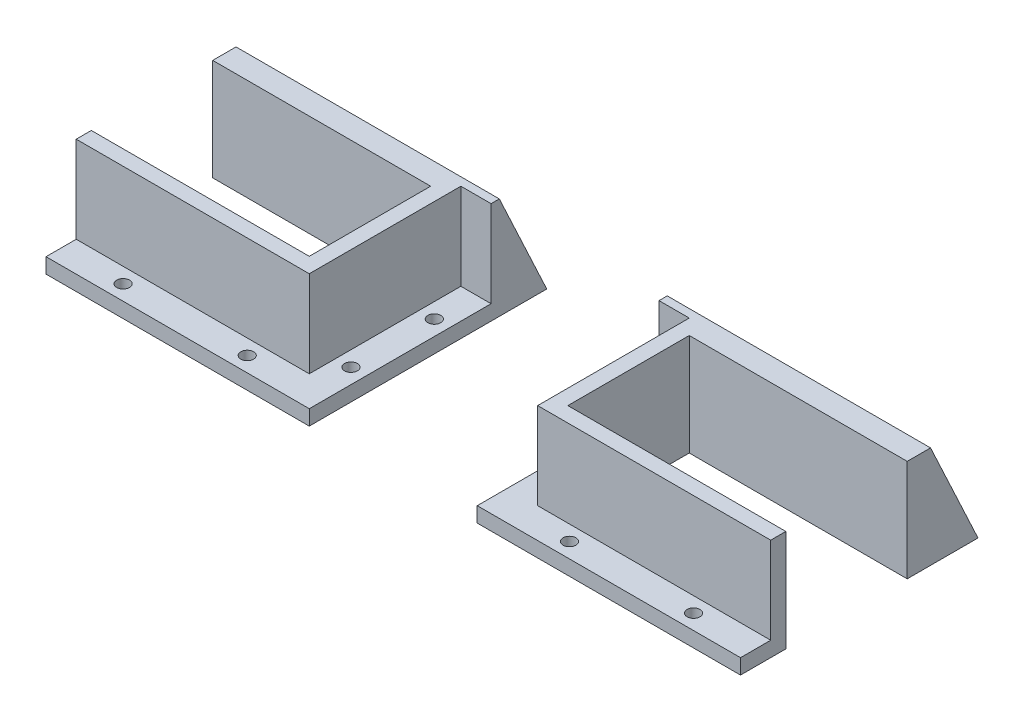
ISO-10303-21;
HEADER;
FILE_DESCRIPTION(('STEP AP214'),'2;1');
FILE_NAME('part.step','',(''),(''),'','','');
FILE_SCHEMA(('AUTOMOTIVE_DESIGN { 1 0 10303 214 1 1 1 1 }'));
ENDSEC;
DATA;
#1=APPLICATION_CONTEXT('core data for automotive mechanical design processes');
#2=APPLICATION_PROTOCOL_DEFINITION('international standard','automotive_design',2000,#1);
#3=PRODUCT_CONTEXT('',#1,'mechanical');
#4=PRODUCT('Part','Part','',(#3));
#5=PRODUCT_RELATED_PRODUCT_CATEGORY('part','',(#4));
#6=PRODUCT_DEFINITION_FORMATION('','',#4);
#7=PRODUCT_DEFINITION_CONTEXT('part definition',#1,'design');
#8=PRODUCT_DEFINITION('design','',#6,#7);
#9=PRODUCT_DEFINITION_SHAPE('','',#8);
#10=(LENGTH_UNIT() NAMED_UNIT(*) SI_UNIT(.MILLI.,.METRE.));
#11=(NAMED_UNIT(*) PLANE_ANGLE_UNIT() SI_UNIT($,.RADIAN.));
#12=(NAMED_UNIT(*) SI_UNIT($,.STERADIAN.) SOLID_ANGLE_UNIT());
#13=UNCERTAINTY_MEASURE_WITH_UNIT(LENGTH_MEASURE(1.E-05),#10,'distance_accuracy_value','');
#14=(GEOMETRIC_REPRESENTATION_CONTEXT(3) GLOBAL_UNCERTAINTY_ASSIGNED_CONTEXT((#13)) GLOBAL_UNIT_ASSIGNED_CONTEXT((#10,
#11,#12)) REPRESENTATION_CONTEXT('',''));
#15=CARTESIAN_POINT('',(0.,0.,0.));
#16=DIRECTION('',(0.,0.,1.));
#17=DIRECTION('',(1.,0.,0.));
#18=AXIS2_PLACEMENT_3D('',#15,#16,#17);
#19=CARTESIAN_POINT('',(24.005,21.395,15.935));
#20=DIRECTION('',(1.,0.,0.));
#21=DIRECTION('',(0.,0.,-1.));
#22=AXIS2_PLACEMENT_3D('',#19,#20,#21);
#23=PLANE('',#22);
#24=DIRECTION('',(0.,0.,-1.));
#25=VECTOR('',#24,1.);
#26=CARTESIAN_POINT('',(24.005,3.175,-15.935));
#27=LINE('',#26,#25);
#28=CARTESIAN_POINT('',(24.005,3.175,15.935));
#29=VERTEX_POINT('',#28);
#30=CARTESIAN_POINT('',(24.005,3.175,-15.935));
#31=VERTEX_POINT('',#30);
#32=EDGE_CURVE('E73',#29,#31,#27,.T.);
#33=ORIENTED_EDGE('',*,*,#32,.F.);
#34=DIRECTION('',(0.,-1.,0.));
#35=VECTOR('',#34,1.);
#36=CARTESIAN_POINT('',(24.005,21.395,15.935));
#37=LINE('',#36,#35);
#38=CARTESIAN_POINT('',(24.005,21.395,15.935));
#39=VERTEX_POINT('',#38);
#40=EDGE_CURVE('E195',#39,#29,#37,.T.);
#41=ORIENTED_EDGE('',*,*,#40,.F.);
#42=DIRECTION('',(0.,0.,1.));
#43=VECTOR('',#42,1.);
#44=CARTESIAN_POINT('',(24.005,21.395,15.935));
#45=LINE('',#44,#43);
#46=CARTESIAN_POINT('',(24.005,21.395,-15.935));
#47=VERTEX_POINT('',#46);
#48=EDGE_CURVE('E162',#47,#39,#45,.T.);
#49=ORIENTED_EDGE('',*,*,#48,.F.);
#50=DIRECTION('',(0.,-1.,0.));
#51=VECTOR('',#50,1.);
#52=CARTESIAN_POINT('',(24.005,21.395,-15.935));
#53=LINE('',#52,#51);
#54=EDGE_CURVE('E197',#47,#31,#53,.T.);
#55=ORIENTED_EDGE('',*,*,#54,.T.);
#56=EDGE_LOOP('',(#33,#41,#49,#55));
#57=FACE_BOUND('',#56,.T.);
#58=ADVANCED_FACE('F49',(#57),#23,.F.);
#59=CARTESIAN_POINT('',(73.,21.395,15.935));
#60=DIRECTION('',(0.,0.,-1.));
#61=DIRECTION('',(-1.,0.,0.));
#62=AXIS2_PLACEMENT_3D('',#59,#60,#61);
#63=PLANE('',#62);
#64=DIRECTION('',(-1.,0.,0.));
#65=VECTOR('',#64,1.);
#66=CARTESIAN_POINT('',(73.,3.175,15.935));
#67=LINE('',#66,#65);
#68=CARTESIAN_POINT('',(73.,3.175,15.935));
#69=VERTEX_POINT('',#68);
#70=EDGE_CURVE('E205',#69,#29,#67,.T.);
#71=ORIENTED_EDGE('',*,*,#70,.F.);
#72=DIRECTION('',(0.,-1.,0.));
#73=VECTOR('',#72,1.);
#74=CARTESIAN_POINT('',(73.,21.395,15.935));
#75=LINE('',#74,#73);
#76=CARTESIAN_POINT('',(73.,21.395,15.935));
#77=VERTEX_POINT('',#76);
#78=EDGE_CURVE('E192',#77,#69,#75,.T.);
#79=ORIENTED_EDGE('',*,*,#78,.F.);
#80=DIRECTION('',(1.,0.,0.));
#81=VECTOR('',#80,1.);
#82=CARTESIAN_POINT('',(73.,21.395,15.935));
#83=LINE('',#82,#81);
#84=EDGE_CURVE('E165',#39,#77,#83,.T.);
#85=ORIENTED_EDGE('',*,*,#84,.F.);
#86=ORIENTED_EDGE('',*,*,#40,.T.);
#87=EDGE_LOOP('',(#71,#79,#85,#86));
#88=FACE_BOUND('',#87,.T.);
#89=ADVANCED_FACE('F281',(#88),#63,.F.);
#90=CARTESIAN_POINT('',(73.,21.395,-15.935));
#91=DIRECTION('',(-1.,0.,0.));
#92=DIRECTION('',(0.,0.,1.));
#93=AXIS2_PLACEMENT_3D('',#90,#91,#92);
#94=PLANE('',#93);
#95=DIRECTION('',(0.,0.,-1.));
#96=VECTOR('',#95,1.);
#97=CARTESIAN_POINT('',(73.,0.,-15.935));
#98=LINE('',#97,#96);
#99=CARTESIAN_POINT('',(73.,0.,-12.76));
#100=VERTEX_POINT('',#99);
#101=CARTESIAN_POINT('',(73.,0.,-27.64));
#102=VERTEX_POINT('',#101);
#103=EDGE_CURVE('E12',#100,#102,#98,.T.);
#104=ORIENTED_EDGE('',*,*,#103,.T.);
#105=DIRECTION('',(0.,0.906307787036653,0.422618261740694));
#106=VECTOR('',#105,1.);
#107=CARTESIAN_POINT('',(73.,10.5867342039042,-22.7033247658681));
#108=LINE('',#107,#106);
#109=CARTESIAN_POINT('',(73.,21.395,-17.663347653774));
#110=VERTEX_POINT('',#109);
#111=EDGE_CURVE('E143',#102,#110,#108,.T.);
#112=ORIENTED_EDGE('',*,*,#111,.T.);
#113=DIRECTION('',(0.,0.,-1.));
#114=VECTOR('',#113,1.);
#115=CARTESIAN_POINT('',(73.,21.395,-15.935));
#116=LINE('',#115,#114);
#117=CARTESIAN_POINT('',(73.,21.395,-12.76));
#118=VERTEX_POINT('',#117);
#119=EDGE_CURVE('E53',#118,#110,#116,.T.);
#120=ORIENTED_EDGE('',*,*,#119,.F.);
#121=DIRECTION('',(0.,-1.,0.));
#122=VECTOR('',#121,1.);
#123=CARTESIAN_POINT('',(73.,21.395,-12.76));
#124=LINE('',#123,#122);
#125=EDGE_CURVE('E176',#118,#100,#124,.T.);
#126=ORIENTED_EDGE('',*,*,#125,.T.);
#127=EDGE_LOOP('',(#104,#112,#120,#126));
#128=FACE_BOUND('',#127,.T.);
#129=ADVANCED_FACE('F153',(#128),#94,.F.);
#130=CARTESIAN_POINT('',(73.,21.395,12.76));
#131=DIRECTION('',(-1.,0.,0.));
#132=DIRECTION('',(0.,0.,1.));
#133=AXIS2_PLACEMENT_3D('',#130,#131,#132);
#134=PLANE('',#133);
#135=DIRECTION('',(0.,0.,-1.));
#136=VECTOR('',#135,1.);
#137=CARTESIAN_POINT('',(73.,0.,12.76));
#138=LINE('',#137,#136);
#139=CARTESIAN_POINT('',(73.,0.,22.285));
#140=VERTEX_POINT('',#139);
#141=CARTESIAN_POINT('',(73.,0.,12.76));
#142=VERTEX_POINT('',#141);
#143=EDGE_CURVE('E58',#140,#142,#138,.T.);
#144=ORIENTED_EDGE('',*,*,#143,.T.);
#145=DIRECTION('',(0.,-1.,0.));
#146=VECTOR('',#145,1.);
#147=CARTESIAN_POINT('',(73.,21.395,12.76));
#148=LINE('',#147,#146);
#149=CARTESIAN_POINT('',(73.,21.395,12.76));
#150=VERTEX_POINT('',#149);
#151=EDGE_CURVE('E189',#150,#142,#148,.T.);
#152=ORIENTED_EDGE('',*,*,#151,.F.);
#153=DIRECTION('',(0.,0.,-1.));
#154=VECTOR('',#153,1.);
#155=CARTESIAN_POINT('',(73.,21.395,12.76));
#156=LINE('',#155,#154);
#157=EDGE_CURVE('E168',#77,#150,#156,.T.);
#158=ORIENTED_EDGE('',*,*,#157,.F.);
#159=ORIENTED_EDGE('',*,*,#78,.T.);
#160=DIRECTION('',(0.,0.,-1.));
#161=VECTOR('',#160,1.);
#162=CARTESIAN_POINT('',(73.,3.175,15.935));
#163=LINE('',#162,#161);
#164=CARTESIAN_POINT('',(73.,3.175,22.285));
#165=VERTEX_POINT('',#164);
#166=EDGE_CURVE('E215',#165,#69,#163,.T.);
#167=ORIENTED_EDGE('',*,*,#166,.F.);
#168=DIRECTION('',(0.,-1.,0.));
#169=VECTOR('',#168,1.);
#170=CARTESIAN_POINT('',(73.,3.175,22.285));
#171=LINE('',#170,#169);
#172=EDGE_CURVE('E202',#165,#140,#171,.T.);
#173=ORIENTED_EDGE('',*,*,#172,.T.);
#174=EDGE_LOOP('',(#144,#152,#158,#159,#167,#173));
#175=FACE_BOUND('',#174,.T.);
#176=ADVANCED_FACE('F270',(#175),#134,.F.);
#177=CARTESIAN_POINT('',(27.18,21.395,12.76));
#178=DIRECTION('',(0.,0.,1.));
#179=DIRECTION('',(1.,0.,0.));
#180=AXIS2_PLACEMENT_3D('',#177,#178,#179);
#181=PLANE('',#180);
#182=DIRECTION('',(-1.,0.,0.));
#183=VECTOR('',#182,1.);
#184=CARTESIAN_POINT('',(27.18,0.,12.76));
#185=LINE('',#184,#183);
#186=CARTESIAN_POINT('',(27.18,0.,12.76));
#187=VERTEX_POINT('',#186);
#188=EDGE_CURVE('E179',#142,#187,#185,.T.);
#189=ORIENTED_EDGE('',*,*,#188,.T.);
#190=DIRECTION('',(0.,-1.,0.));
#191=VECTOR('',#190,1.);
#192=CARTESIAN_POINT('',(27.18,21.395,12.76));
#193=LINE('',#192,#191);
#194=CARTESIAN_POINT('',(27.18,21.395,12.76));
#195=VERTEX_POINT('',#194);
#196=EDGE_CURVE('E186',#195,#187,#193,.T.);
#197=ORIENTED_EDGE('',*,*,#196,.F.);
#198=DIRECTION('',(-1.,0.,0.));
#199=VECTOR('',#198,1.);
#200=CARTESIAN_POINT('',(27.18,21.395,12.76));
#201=LINE('',#200,#199);
#202=EDGE_CURVE('E172',#150,#195,#201,.T.);
#203=ORIENTED_EDGE('',*,*,#202,.F.);
#204=ORIENTED_EDGE('',*,*,#151,.T.);
#205=EDGE_LOOP('',(#189,#197,#203,#204));
#206=FACE_BOUND('',#205,.T.);
#207=ADVANCED_FACE('F285',(#206),#181,.F.);
#208=CARTESIAN_POINT('',(27.18,21.395,-12.76));
#209=DIRECTION('',(-1.,0.,0.));
#210=DIRECTION('',(0.,0.,1.));
#211=AXIS2_PLACEMENT_3D('',#208,#209,#210);
#212=PLANE('',#211);
#213=DIRECTION('',(0.,0.,-1.));
#214=VECTOR('',#213,1.);
#215=CARTESIAN_POINT('',(27.18,0.,-12.76));
#216=LINE('',#215,#214);
#217=CARTESIAN_POINT('',(27.18,0.,-12.76));
#218=VERTEX_POINT('',#217);
#219=EDGE_CURVE('E163',#187,#218,#216,.T.);
#220=ORIENTED_EDGE('',*,*,#219,.T.);
#221=DIRECTION('',(0.,-1.,0.));
#222=VECTOR('',#221,1.);
#223=CARTESIAN_POINT('',(27.18,21.395,-12.76));
#224=LINE('',#223,#222);
#225=CARTESIAN_POINT('',(27.18,21.395,-12.76));
#226=VERTEX_POINT('',#225);
#227=EDGE_CURVE('E183',#226,#218,#224,.T.);
#228=ORIENTED_EDGE('',*,*,#227,.F.);
#229=DIRECTION('',(0.,0.,-1.));
#230=VECTOR('',#229,1.);
#231=CARTESIAN_POINT('',(27.18,21.395,-12.76));
#232=LINE('',#231,#230);
#233=EDGE_CURVE('E174',#195,#226,#232,.T.);
#234=ORIENTED_EDGE('',*,*,#233,.F.);
#235=ORIENTED_EDGE('',*,*,#196,.T.);
#236=EDGE_LOOP('',(#220,#228,#234,#235));
#237=FACE_BOUND('',#236,.T.);
#238=ADVANCED_FACE('F290',(#237),#212,.F.);
#239=CARTESIAN_POINT('',(73.,21.395,-12.76));
#240=DIRECTION('',(0.,0.,-1.));
#241=DIRECTION('',(-1.,0.,0.));
#242=AXIS2_PLACEMENT_3D('',#239,#240,#241);
#243=PLANE('',#242);
#244=DIRECTION('',(1.,0.,0.));
#245=VECTOR('',#244,1.);
#246=CARTESIAN_POINT('',(73.,0.,-12.76));
#247=LINE('',#246,#245);
#248=EDGE_CURVE('E161',#218,#100,#247,.T.);
#249=ORIENTED_EDGE('',*,*,#248,.T.);
#250=ORIENTED_EDGE('',*,*,#125,.F.);
#251=DIRECTION('',(1.,0.,0.));
#252=VECTOR('',#251,1.);
#253=CARTESIAN_POINT('',(73.,21.395,-12.76));
#254=LINE('',#253,#252);
#255=EDGE_CURVE('E159',#226,#118,#254,.T.);
#256=ORIENTED_EDGE('',*,*,#255,.F.);
#257=ORIENTED_EDGE('',*,*,#227,.T.);
#258=EDGE_LOOP('',(#249,#250,#256,#257));
#259=FACE_BOUND('',#258,.T.);
#260=ADVANCED_FACE('F293',(#259),#243,.F.);
#261=CARTESIAN_POINT('',(0.,21.395,0.));
#262=DIRECTION('',(0.,-1.,0.));
#263=DIRECTION('',(0.,0.,-1.));
#264=AXIS2_PLACEMENT_3D('',#261,#262,#263);
#265=PLANE('',#264);
#266=ORIENTED_EDGE('',*,*,#119,.T.);
#267=DIRECTION('',(-1.,0.,0.));
#268=VECTOR('',#267,1.);
#269=CARTESIAN_POINT('',(73.,21.395,-17.663347653774));
#270=LINE('',#269,#268);
#271=CARTESIAN_POINT('',(17.655,21.395,-17.663347653774));
#272=VERTEX_POINT('',#271);
#273=EDGE_CURVE('E140',#110,#272,#270,.T.);
#274=ORIENTED_EDGE('',*,*,#273,.T.);
#275=DIRECTION('',(0.,0.,-1.));
#276=VECTOR('',#275,1.);
#277=CARTESIAN_POINT('',(17.655,21.395,-27.64));
#278=LINE('',#277,#276);
#279=CARTESIAN_POINT('',(17.655,21.395,-15.935));
#280=VERTEX_POINT('',#279);
#281=EDGE_CURVE('E251',#280,#272,#278,.T.);
#282=ORIENTED_EDGE('',*,*,#281,.F.);
#283=DIRECTION('',(-1.,0.,0.));
#284=VECTOR('',#283,1.);
#285=CARTESIAN_POINT('',(17.655,21.395,-15.935));
#286=LINE('',#285,#284);
#287=EDGE_CURVE('E248',#47,#280,#286,.T.);
#288=ORIENTED_EDGE('',*,*,#287,.F.);
#289=ORIENTED_EDGE('',*,*,#48,.T.);
#290=ORIENTED_EDGE('',*,*,#84,.T.);
#291=ORIENTED_EDGE('',*,*,#157,.T.);
#292=ORIENTED_EDGE('',*,*,#202,.T.);
#293=ORIENTED_EDGE('',*,*,#233,.T.);
#294=ORIENTED_EDGE('',*,*,#255,.T.);
#295=EDGE_LOOP('',(#266,#274,#282,#288,#289,#290,#291,#292,#293,#294));
#296=FACE_BOUND('',#295,.T.);
#297=ADVANCED_FACE('F51',(#296),#265,.F.);
#298=CARTESIAN_POINT('',(0.,0.,0.));
#299=DIRECTION('',(0.,-1.,0.));
#300=DIRECTION('',(0.,0.,-1.));
#301=AXIS2_PLACEMENT_3D('',#298,#299,#300);
#302=PLANE('',#301);
#303=ORIENTED_EDGE('',*,*,#103,.F.);
#304=ORIENTED_EDGE('',*,*,#248,.F.);
#305=ORIENTED_EDGE('',*,*,#219,.F.);
#306=ORIENTED_EDGE('',*,*,#188,.F.);
#307=ORIENTED_EDGE('',*,*,#143,.F.);
#308=DIRECTION('',(1.,0.,0.));
#309=VECTOR('',#308,1.);
#310=CARTESIAN_POINT('',(73.,0.,22.285));
#311=LINE('',#310,#309);
#312=CARTESIAN_POINT('',(17.655,0.,22.285));
#313=VERTEX_POINT('',#312);
#314=EDGE_CURVE('E206',#313,#140,#311,.T.);
#315=ORIENTED_EDGE('',*,*,#314,.F.);
#316=DIRECTION('',(0.,0.,1.));
#317=VECTOR('',#316,1.);
#318=CARTESIAN_POINT('',(17.655,0.,-15.935));
#319=LINE('',#318,#317);
#320=CARTESIAN_POINT('',(17.655,0.,-27.64));
#321=VERTEX_POINT('',#320);
#322=EDGE_CURVE('E209',#321,#313,#319,.T.);
#323=ORIENTED_EDGE('',*,*,#322,.F.);
#324=DIRECTION('',(-1.,0.,0.));
#325=VECTOR('',#324,1.);
#326=CARTESIAN_POINT('',(73.,0.,-27.64));
#327=LINE('',#326,#325);
#328=EDGE_CURVE('E245',#102,#321,#327,.T.);
#329=ORIENTED_EDGE('',*,*,#328,.F.);
#330=EDGE_LOOP('',(#303,#304,#305,#306,#307,#315,#323,#329));
#331=FACE_BOUND('',#330,.T.);
#332=CARTESIAN_POINT('',(33.8725,0.,19.11));
#333=DIRECTION('',(0.,1.,0.));
#334=DIRECTION('',(0.,0.,1.));
#335=AXIS2_PLACEMENT_3D('',#332,#333,#334);
#336=CIRCLE('',#335,1.35);
#337=CARTESIAN_POINT('',(33.8725,0.,20.46));
#338=VERTEX_POINT('',#337);
#339=EDGE_CURVE('E236',#338,#338,#336,.T.);
#340=ORIENTED_EDGE('',*,*,#339,.T.);
#341=EDGE_LOOP('',(#340));
#342=FACE_BOUND('',#341,.T.);
#343=CARTESIAN_POINT('',(20.83,0.,-7.17374999999999));
#344=DIRECTION('',(0.,1.,0.));
#345=DIRECTION('',(0.,0.,1.));
#346=AXIS2_PLACEMENT_3D('',#343,#344,#345);
#347=CIRCLE('',#346,1.35);
#348=CARTESIAN_POINT('',(20.83,0.,-5.82374999999999));
#349=VERTEX_POINT('',#348);
#350=EDGE_CURVE('E224',#349,#349,#347,.T.);
#351=ORIENTED_EDGE('',*,*,#350,.T.);
#352=EDGE_LOOP('',(#351));
#353=FACE_BOUND('',#352,.T.);
#354=CARTESIAN_POINT('',(20.83,0.,10.34875));
#355=DIRECTION('',(0.,1.,0.));
#356=DIRECTION('',(0.,0.,1.));
#357=AXIS2_PLACEMENT_3D('',#354,#355,#356);
#358=CIRCLE('',#357,1.35);
#359=CARTESIAN_POINT('',(20.83,0.,11.69875));
#360=VERTEX_POINT('',#359);
#361=EDGE_CURVE('E230',#360,#360,#358,.T.);
#362=ORIENTED_EDGE('',*,*,#361,.T.);
#363=EDGE_LOOP('',(#362));
#364=FACE_BOUND('',#363,.T.);
#365=CARTESIAN_POINT('',(59.9575,0.,19.11));
#366=DIRECTION('',(0.,1.,0.));
#367=DIRECTION('',(0.,0.,1.));
#368=AXIS2_PLACEMENT_3D('',#365,#366,#367);
#369=CIRCLE('',#368,1.35);
#370=CARTESIAN_POINT('',(59.9575,0.,20.46));
#371=VERTEX_POINT('',#370);
#372=EDGE_CURVE('E242',#371,#371,#369,.T.);
#373=ORIENTED_EDGE('',*,*,#372,.T.);
#374=EDGE_LOOP('',(#373));
#375=FACE_BOUND('',#374,.T.);
#376=ADVANCED_FACE('F261',(#331,#342,#353,#364,#375),#302,.T.);
#377=CARTESIAN_POINT('',(0.,3.175,0.));
#378=DIRECTION('',(0.,-1.,0.));
#379=DIRECTION('',(0.,0.,-1.));
#380=AXIS2_PLACEMENT_3D('',#377,#378,#379);
#381=PLANE('',#380);
#382=ORIENTED_EDGE('',*,*,#32,.T.);
#383=DIRECTION('',(-1.,0.,0.));
#384=VECTOR('',#383,1.);
#385=CARTESIAN_POINT('',(24.005,3.175,-15.935));
#386=LINE('',#385,#384);
#387=CARTESIAN_POINT('',(17.655,3.175,-15.935));
#388=VERTEX_POINT('',#387);
#389=EDGE_CURVE('E66',#31,#388,#386,.T.);
#390=ORIENTED_EDGE('',*,*,#389,.T.);
#391=DIRECTION('',(0.,0.,1.));
#392=VECTOR('',#391,1.);
#393=CARTESIAN_POINT('',(17.655,3.175,-15.935));
#394=LINE('',#393,#392);
#395=CARTESIAN_POINT('',(17.655,3.175,22.285));
#396=VERTEX_POINT('',#395);
#397=EDGE_CURVE('E220',#388,#396,#394,.T.);
#398=ORIENTED_EDGE('',*,*,#397,.T.);
#399=DIRECTION('',(1.,0.,0.));
#400=VECTOR('',#399,1.);
#401=CARTESIAN_POINT('',(24.005,3.175,22.285));
#402=LINE('',#401,#400);
#403=EDGE_CURVE('E218',#396,#165,#402,.T.);
#404=ORIENTED_EDGE('',*,*,#403,.T.);
#405=ORIENTED_EDGE('',*,*,#166,.T.);
#406=ORIENTED_EDGE('',*,*,#70,.T.);
#407=EDGE_LOOP('',(#382,#390,#398,#404,#405,#406));
#408=FACE_BOUND('',#407,.T.);
#409=CARTESIAN_POINT('',(20.83,3.175,-7.17374999999999));
#410=DIRECTION('',(0.,1.,0.));
#411=DIRECTION('',(0.,0.,1.));
#412=AXIS2_PLACEMENT_3D('',#409,#410,#411);
#413=CIRCLE('',#412,1.35);
#414=CARTESIAN_POINT('',(20.83,3.175,-5.82374999999999));
#415=VERTEX_POINT('',#414);
#416=EDGE_CURVE('E212',#415,#415,#413,.T.);
#417=ORIENTED_EDGE('',*,*,#416,.F.);
#418=EDGE_LOOP('',(#417));
#419=FACE_BOUND('',#418,.T.);
#420=CARTESIAN_POINT('',(20.83,3.175,10.34875));
#421=DIRECTION('',(0.,1.,0.));
#422=DIRECTION('',(0.,0.,1.));
#423=AXIS2_PLACEMENT_3D('',#420,#421,#422);
#424=CIRCLE('',#423,1.35);
#425=CARTESIAN_POINT('',(20.83,3.175,11.69875));
#426=VERTEX_POINT('',#425);
#427=EDGE_CURVE('E227',#426,#426,#424,.T.);
#428=ORIENTED_EDGE('',*,*,#427,.F.);
#429=EDGE_LOOP('',(#428));
#430=FACE_BOUND('',#429,.T.);
#431=CARTESIAN_POINT('',(33.8725,3.175,19.11));
#432=DIRECTION('',(0.,1.,0.));
#433=DIRECTION('',(0.,0.,1.));
#434=AXIS2_PLACEMENT_3D('',#431,#432,#433);
#435=CIRCLE('',#434,1.35);
#436=CARTESIAN_POINT('',(33.8725,3.175,20.46));
#437=VERTEX_POINT('',#436);
#438=EDGE_CURVE('E233',#437,#437,#435,.T.);
#439=ORIENTED_EDGE('',*,*,#438,.F.);
#440=EDGE_LOOP('',(#439));
#441=FACE_BOUND('',#440,.T.);
#442=CARTESIAN_POINT('',(59.9575,3.175,19.11));
#443=DIRECTION('',(0.,1.,0.));
#444=DIRECTION('',(0.,0.,1.));
#445=AXIS2_PLACEMENT_3D('',#442,#443,#444);
#446=CIRCLE('',#445,1.35);
#447=CARTESIAN_POINT('',(59.9575,3.175,20.46));
#448=VERTEX_POINT('',#447);
#449=EDGE_CURVE('E239',#448,#448,#446,.T.);
#450=ORIENTED_EDGE('',*,*,#449,.F.);
#451=EDGE_LOOP('',(#450));
#452=FACE_BOUND('',#451,.T.);
#453=ADVANCED_FACE('F275',(#408,#419,#430,#441,#452),#381,.F.);
#454=CARTESIAN_POINT('',(17.655,3.175,-15.935));
#455=DIRECTION('',(1.,0.,0.));
#456=DIRECTION('',(0.,0.,-1.));
#457=AXIS2_PLACEMENT_3D('',#454,#455,#456);
#458=PLANE('',#457);
#459=ORIENTED_EDGE('',*,*,#281,.T.);
#460=DIRECTION('',(0.,-0.906307787036653,-0.422618261740694));
#461=VECTOR('',#460,1.);
#462=CARTESIAN_POINT('',(17.655,7.09120043373117,-24.3333189322392));
#463=LINE('',#462,#461);
#464=EDGE_CURVE('E145',#272,#321,#463,.T.);
#465=ORIENTED_EDGE('',*,*,#464,.T.);
#466=ORIENTED_EDGE('',*,*,#322,.T.);
#467=DIRECTION('',(0.,-1.,0.));
#468=VECTOR('',#467,1.);
#469=CARTESIAN_POINT('',(17.655,3.175,22.285));
#470=LINE('',#469,#468);
#471=EDGE_CURVE('E199',#396,#313,#470,.T.);
#472=ORIENTED_EDGE('',*,*,#471,.F.);
#473=ORIENTED_EDGE('',*,*,#397,.F.);
#474=DIRECTION('',(0.,-1.,0.));
#475=VECTOR('',#474,1.);
#476=CARTESIAN_POINT('',(17.655,77.9642146843139,-15.935));
#477=LINE('',#476,#475);
#478=EDGE_CURVE('E250',#280,#388,#477,.T.);
#479=ORIENTED_EDGE('',*,*,#478,.F.);
#480=EDGE_LOOP('',(#459,#465,#466,#472,#473,#479));
#481=FACE_BOUND('',#480,.T.);
#482=ADVANCED_FACE('F257',(#481),#458,.F.);
#483=CARTESIAN_POINT('',(73.,3.175,22.285));
#484=DIRECTION('',(0.,0.,-1.));
#485=DIRECTION('',(-1.,0.,0.));
#486=AXIS2_PLACEMENT_3D('',#483,#484,#485);
#487=PLANE('',#486);
#488=ORIENTED_EDGE('',*,*,#314,.T.);
#489=ORIENTED_EDGE('',*,*,#172,.F.);
#490=ORIENTED_EDGE('',*,*,#403,.F.);
#491=ORIENTED_EDGE('',*,*,#471,.T.);
#492=EDGE_LOOP('',(#488,#489,#490,#491));
#493=FACE_BOUND('',#492,.T.);
#494=ADVANCED_FACE('F266',(#493),#487,.F.);
#495=CARTESIAN_POINT('',(20.83,3.175,-7.17374999999999));
#496=DIRECTION('',(0.,-1.,0.));
#497=DIRECTION('',(0.,0.,-1.));
#498=AXIS2_PLACEMENT_3D('',#495,#496,#497);
#499=CYLINDRICAL_SURFACE('',#498,1.35);
#500=ORIENTED_EDGE('',*,*,#416,.T.);
#501=EDGE_LOOP('',(#500));
#502=FACE_BOUND('',#501,.T.);
#503=ORIENTED_EDGE('',*,*,#350,.F.);
#504=EDGE_LOOP('',(#503));
#505=FACE_BOUND('',#504,.T.);
#506=ADVANCED_FACE('F368',(#502,#505),#499,.F.);
#507=CARTESIAN_POINT('',(20.83,3.175,10.34875));
#508=DIRECTION('',(0.,-1.,0.));
#509=DIRECTION('',(0.,0.,-1.));
#510=AXIS2_PLACEMENT_3D('',#507,#508,#509);
#511=CYLINDRICAL_SURFACE('',#510,1.35);
#512=ORIENTED_EDGE('',*,*,#427,.T.);
#513=EDGE_LOOP('',(#512));
#514=FACE_BOUND('',#513,.T.);
#515=ORIENTED_EDGE('',*,*,#361,.F.);
#516=EDGE_LOOP('',(#515));
#517=FACE_BOUND('',#516,.T.);
#518=ADVANCED_FACE('F378',(#514,#517),#511,.F.);
#519=CARTESIAN_POINT('',(33.8725,3.175,19.11));
#520=DIRECTION('',(0.,-1.,0.));
#521=DIRECTION('',(0.,0.,-1.));
#522=AXIS2_PLACEMENT_3D('',#519,#520,#521);
#523=CYLINDRICAL_SURFACE('',#522,1.35);
#524=ORIENTED_EDGE('',*,*,#438,.T.);
#525=EDGE_LOOP('',(#524));
#526=FACE_BOUND('',#525,.T.);
#527=ORIENTED_EDGE('',*,*,#339,.F.);
#528=EDGE_LOOP('',(#527));
#529=FACE_BOUND('',#528,.T.);
#530=ADVANCED_FACE('F388',(#526,#529),#523,.F.);
#531=CARTESIAN_POINT('',(59.9575,3.175,19.11));
#532=DIRECTION('',(0.,-1.,0.));
#533=DIRECTION('',(0.,0.,-1.));
#534=AXIS2_PLACEMENT_3D('',#531,#532,#533);
#535=CYLINDRICAL_SURFACE('',#534,1.35);
#536=ORIENTED_EDGE('',*,*,#449,.T.);
#537=EDGE_LOOP('',(#536));
#538=FACE_BOUND('',#537,.T.);
#539=ORIENTED_EDGE('',*,*,#372,.F.);
#540=EDGE_LOOP('',(#539));
#541=FACE_BOUND('',#540,.T.);
#542=ADVANCED_FACE('F398',(#538,#541),#535,.F.);
#543=CARTESIAN_POINT('',(17.655,77.9642146843139,-15.935));
#544=DIRECTION('',(0.,0.,-1.));
#545=DIRECTION('',(-1.,0.,0.));
#546=AXIS2_PLACEMENT_3D('',#543,#544,#545);
#547=PLANE('',#546);
#548=ORIENTED_EDGE('',*,*,#389,.F.);
#549=ORIENTED_EDGE('',*,*,#54,.F.);
#550=ORIENTED_EDGE('',*,*,#287,.T.);
#551=ORIENTED_EDGE('',*,*,#478,.T.);
#552=EDGE_LOOP('',(#548,#549,#550,#551));
#553=FACE_BOUND('',#552,.T.);
#554=ADVANCED_FACE('F278',(#553),#547,.F.);
#555=CARTESIAN_POINT('',(73.,10.5867342039042,-22.7033247658681));
#556=DIRECTION('',(0.,-0.422618261740694,0.906307787036653));
#557=DIRECTION('',(0.,-0.906307787036653,-0.422618261740694));
#558=AXIS2_PLACEMENT_3D('',#555,#556,#557);
#559=PLANE('',#558);
#560=ORIENTED_EDGE('',*,*,#273,.F.);
#561=ORIENTED_EDGE('',*,*,#111,.F.);
#562=ORIENTED_EDGE('',*,*,#328,.T.);
#563=ORIENTED_EDGE('',*,*,#464,.F.);
#564=EDGE_LOOP('',(#560,#561,#562,#563));
#565=FACE_BOUND('',#564,.T.);
#566=ADVANCED_FACE('F142',(#565),#559,.F.);
#567=CLOSED_SHELL('',(#58,#89,#129,#176,#207,#238,#260,#297,#376,#453,#482,#494,#506,#518,#530,
#542,#554,#566));
#568=MANIFOLD_SOLID_BREP('B2',#567);
#569=CARTESIAN_POINT('',(-73.,21.395,-12.76));
#570=DIRECTION('',(1.,0.,0.));
#571=DIRECTION('',(0.,0.,-1.));
#572=AXIS2_PLACEMENT_3D('',#569,#570,#571);
#573=PLANE('',#572);
#574=DIRECTION('',(0.,0.,1.));
#575=VECTOR('',#574,1.);
#576=CARTESIAN_POINT('',(-73.,21.395,-12.76));
#577=LINE('',#576,#575);
#578=CARTESIAN_POINT('',(-73.,21.395,-17.663347653774));
#579=VERTEX_POINT('',#578);
#580=CARTESIAN_POINT('',(-73.,21.395,-12.76));
#581=VERTEX_POINT('',#580);
#582=EDGE_CURVE('E663',#579,#581,#577,.T.);
#583=ORIENTED_EDGE('',*,*,#582,.F.);
#584=DIRECTION('',(0.,0.906307787036653,0.422618261740694));
#585=VECTOR('',#584,1.);
#586=CARTESIAN_POINT('',(-73.,10.5867342039042,-22.7033247658681));
#587=LINE('',#586,#585);
#588=CARTESIAN_POINT('',(-73.,0.,-27.64));
#589=VERTEX_POINT('',#588);
#590=EDGE_CURVE('E648',#589,#579,#587,.T.);
#591=ORIENTED_EDGE('',*,*,#590,.F.);
#592=DIRECTION('',(0.,0.,1.));
#593=VECTOR('',#592,1.);
#594=CARTESIAN_POINT('',(-73.,0.,-12.76));
#595=LINE('',#594,#593);
#596=CARTESIAN_POINT('',(-73.,0.,-12.76));
#597=VERTEX_POINT('',#596);
#598=EDGE_CURVE('E662',#589,#597,#595,.T.);
#599=ORIENTED_EDGE('',*,*,#598,.T.);
#600=DIRECTION('',(0.,-1.,0.));
#601=VECTOR('',#600,1.);
#602=CARTESIAN_POINT('',(-73.,21.395,-12.76));
#603=LINE('',#602,#601);
#604=EDGE_CURVE('E47',#581,#597,#603,.T.);
#605=ORIENTED_EDGE('',*,*,#604,.F.);
#606=EDGE_LOOP('',(#583,#591,#599,#605));
#607=FACE_BOUND('',#606,.T.);
#608=ADVANCED_FACE('F558',(#607),#573,.F.);
#609=CARTESIAN_POINT('',(-73.,21.395,-12.76));
#610=DIRECTION('',(0.,0.,-1.));
#611=DIRECTION('',(-1.,0.,0.));
#612=AXIS2_PLACEMENT_3D('',#609,#610,#611);
#613=PLANE('',#612);
#614=DIRECTION('',(1.,0.,0.));
#615=VECTOR('',#614,1.);
#616=CARTESIAN_POINT('',(-73.,0.,-12.76));
#617=LINE('',#616,#615);
#618=CARTESIAN_POINT('',(-27.18,0.,-12.76));
#619=VERTEX_POINT('',#618);
#620=EDGE_CURVE('E669',#597,#619,#617,.T.);
#621=ORIENTED_EDGE('',*,*,#620,.T.);
#622=DIRECTION('',(0.,-1.,0.));
#623=VECTOR('',#622,1.);
#624=CARTESIAN_POINT('',(-27.18,21.395,-12.76));
#625=LINE('',#624,#623);
#626=CARTESIAN_POINT('',(-27.18,21.395,-12.76));
#627=VERTEX_POINT('',#626);
#628=EDGE_CURVE('E565',#627,#619,#625,.T.);
#629=ORIENTED_EDGE('',*,*,#628,.F.);
#630=DIRECTION('',(1.,0.,0.));
#631=VECTOR('',#630,1.);
#632=CARTESIAN_POINT('',(-73.,21.395,-12.76));
#633=LINE('',#632,#631);
#634=EDGE_CURVE('E725',#581,#627,#633,.T.);
#635=ORIENTED_EDGE('',*,*,#634,.F.);
#636=ORIENTED_EDGE('',*,*,#604,.T.);
#637=EDGE_LOOP('',(#621,#629,#635,#636));
#638=FACE_BOUND('',#637,.T.);
#639=ADVANCED_FACE('F815',(#638),#613,.F.);
#640=CARTESIAN_POINT('',(-27.18,21.395,-12.76));
#641=DIRECTION('',(1.,0.,0.));
#642=DIRECTION('',(0.,0.,-1.));
#643=AXIS2_PLACEMENT_3D('',#640,#641,#642);
#644=PLANE('',#643);
#645=DIRECTION('',(0.,0.,1.));
#646=VECTOR('',#645,1.);
#647=CARTESIAN_POINT('',(-27.18,0.,-12.76));
#648=LINE('',#647,#646);
#649=CARTESIAN_POINT('',(-27.18,0.,12.76));
#650=VERTEX_POINT('',#649);
#651=EDGE_CURVE('E672',#619,#650,#648,.T.);
#652=ORIENTED_EDGE('',*,*,#651,.T.);
#653=DIRECTION('',(0.,-1.,0.));
#654=VECTOR('',#653,1.);
#655=CARTESIAN_POINT('',(-27.18,21.395,12.76));
#656=LINE('',#655,#654);
#657=CARTESIAN_POINT('',(-27.18,21.395,12.76));
#658=VERTEX_POINT('',#657);
#659=EDGE_CURVE('E694',#658,#650,#656,.T.);
#660=ORIENTED_EDGE('',*,*,#659,.F.);
#661=DIRECTION('',(0.,0.,1.));
#662=VECTOR('',#661,1.);
#663=CARTESIAN_POINT('',(-27.18,21.395,-12.76));
#664=LINE('',#663,#662);
#665=EDGE_CURVE('E702',#627,#658,#664,.T.);
#666=ORIENTED_EDGE('',*,*,#665,.F.);
#667=ORIENTED_EDGE('',*,*,#628,.T.);
#668=EDGE_LOOP('',(#652,#660,#666,#667));
#669=FACE_BOUND('',#668,.T.);
#670=ADVANCED_FACE('F700',(#669),#644,.F.);
#671=CARTESIAN_POINT('',(-27.18,21.395,12.76));
#672=DIRECTION('',(0.,0.,1.));
#673=DIRECTION('',(1.,0.,0.));
#674=AXIS2_PLACEMENT_3D('',#671,#672,#673);
#675=PLANE('',#674);
#676=DIRECTION('',(-1.,0.,0.));
#677=VECTOR('',#676,1.);
#678=CARTESIAN_POINT('',(-27.18,0.,12.76));
#679=LINE('',#678,#677);
#680=CARTESIAN_POINT('',(-73.,0.,12.76));
#681=VERTEX_POINT('',#680);
#682=EDGE_CURVE('E682',#650,#681,#679,.T.);
#683=ORIENTED_EDGE('',*,*,#682,.T.);
#684=DIRECTION('',(0.,-1.,0.));
#685=VECTOR('',#684,1.);
#686=CARTESIAN_POINT('',(-73.,21.395,12.76));
#687=LINE('',#686,#685);
#688=CARTESIAN_POINT('',(-73.,21.395,12.76));
#689=VERTEX_POINT('',#688);
#690=EDGE_CURVE('E691',#689,#681,#687,.T.);
#691=ORIENTED_EDGE('',*,*,#690,.F.);
#692=DIRECTION('',(-1.,0.,0.));
#693=VECTOR('',#692,1.);
#694=CARTESIAN_POINT('',(-27.18,21.395,12.76));
#695=LINE('',#694,#693);
#696=EDGE_CURVE('E720',#658,#689,#695,.T.);
#697=ORIENTED_EDGE('',*,*,#696,.F.);
#698=ORIENTED_EDGE('',*,*,#659,.T.);
#699=EDGE_LOOP('',(#683,#691,#697,#698));
#700=FACE_BOUND('',#699,.T.);
#701=ADVANCED_FACE('F710',(#700),#675,.F.);
#702=CARTESIAN_POINT('',(-73.,21.395,15.935));
#703=DIRECTION('',(1.,0.,0.));
#704=DIRECTION('',(0.,0.,-1.));
#705=AXIS2_PLACEMENT_3D('',#702,#703,#704);
#706=PLANE('',#705);
#707=DIRECTION('',(0.,0.,1.));
#708=VECTOR('',#707,1.);
#709=CARTESIAN_POINT('',(-73.,0.,15.935));
#710=LINE('',#709,#708);
#711=CARTESIAN_POINT('',(-73.,0.,22.285));
#712=VERTEX_POINT('',#711);
#713=EDGE_CURVE('E684',#681,#712,#710,.T.);
#714=ORIENTED_EDGE('',*,*,#713,.T.);
#715=DIRECTION('',(0.,-1.,0.));
#716=VECTOR('',#715,1.);
#717=CARTESIAN_POINT('',(-73.,3.175,22.285));
#718=LINE('',#717,#716);
#719=CARTESIAN_POINT('',(-73.,3.175,22.285));
#720=VERTEX_POINT('',#719);
#721=EDGE_CURVE('E769',#720,#712,#718,.T.);
#722=ORIENTED_EDGE('',*,*,#721,.F.);
#723=DIRECTION('',(0.,0.,1.));
#724=VECTOR('',#723,1.);
#725=CARTESIAN_POINT('',(-73.,3.175,15.935));
#726=LINE('',#725,#724);
#727=CARTESIAN_POINT('',(-73.,3.175,15.935));
#728=VERTEX_POINT('',#727);
#729=EDGE_CURVE('E754',#728,#720,#726,.T.);
#730=ORIENTED_EDGE('',*,*,#729,.F.);
#731=DIRECTION('',(0.,-1.,0.));
#732=VECTOR('',#731,1.);
#733=CARTESIAN_POINT('',(-73.,21.395,15.935));
#734=LINE('',#733,#732);
#735=CARTESIAN_POINT('',(-73.,21.395,15.935));
#736=VERTEX_POINT('',#735);
#737=EDGE_CURVE('E572',#736,#728,#734,.T.);
#738=ORIENTED_EDGE('',*,*,#737,.F.);
#739=DIRECTION('',(0.,0.,1.));
#740=VECTOR('',#739,1.);
#741=CARTESIAN_POINT('',(-73.,21.395,15.935));
#742=LINE('',#741,#740);
#743=EDGE_CURVE('E716',#689,#736,#742,.T.);
#744=ORIENTED_EDGE('',*,*,#743,.F.);
#745=ORIENTED_EDGE('',*,*,#690,.T.);
#746=EDGE_LOOP('',(#714,#722,#730,#738,#744,#745));
#747=FACE_BOUND('',#746,.T.);
#748=ADVANCED_FACE('F714',(#747),#706,.F.);
#749=CARTESIAN_POINT('',(-24.005,21.395,15.935));
#750=DIRECTION('',(0.,0.,-1.));
#751=DIRECTION('',(-1.,0.,0.));
#752=AXIS2_PLACEMENT_3D('',#749,#750,#751);
#753=PLANE('',#752);
#754=ORIENTED_EDGE('',*,*,#737,.T.);
#755=DIRECTION('',(-1.,0.,0.));
#756=VECTOR('',#755,1.);
#757=CARTESIAN_POINT('',(-73.,3.175,15.935));
#758=LINE('',#757,#756);
#759=CARTESIAN_POINT('',(-24.005,3.175,15.935));
#760=VERTEX_POINT('',#759);
#761=EDGE_CURVE('E576',#760,#728,#758,.T.);
#762=ORIENTED_EDGE('',*,*,#761,.F.);
#763=DIRECTION('',(0.,-1.,0.));
#764=VECTOR('',#763,1.);
#765=CARTESIAN_POINT('',(-24.005,21.395,15.935));
#766=LINE('',#765,#764);
#767=CARTESIAN_POINT('',(-24.005,21.395,15.935));
#768=VERTEX_POINT('',#767);
#769=EDGE_CURVE('E688',#768,#760,#766,.T.);
#770=ORIENTED_EDGE('',*,*,#769,.F.);
#771=DIRECTION('',(1.,0.,0.));
#772=VECTOR('',#771,1.);
#773=CARTESIAN_POINT('',(-24.005,21.395,15.935));
#774=LINE('',#773,#772);
#775=EDGE_CURVE('E719',#736,#768,#774,.T.);
#776=ORIENTED_EDGE('',*,*,#775,.F.);
#777=EDGE_LOOP('',(#754,#762,#770,#776));
#778=FACE_BOUND('',#777,.T.);
#779=ADVANCED_FACE('F798',(#778),#753,.F.);
#780=CARTESIAN_POINT('',(-24.005,21.395,-15.935));
#781=DIRECTION('',(-1.,0.,0.));
#782=DIRECTION('',(0.,0.,1.));
#783=AXIS2_PLACEMENT_3D('',#780,#781,#782);
#784=PLANE('',#783);
#785=ORIENTED_EDGE('',*,*,#769,.T.);
#786=DIRECTION('',(0.,0.,1.));
#787=VECTOR('',#786,1.);
#788=CARTESIAN_POINT('',(-24.005,3.175,-15.935));
#789=LINE('',#788,#787);
#790=CARTESIAN_POINT('',(-24.005,3.175,-15.935));
#791=VERTEX_POINT('',#790);
#792=EDGE_CURVE('E749',#791,#760,#789,.T.);
#793=ORIENTED_EDGE('',*,*,#792,.F.);
#794=DIRECTION('',(0.,-1.,0.));
#795=VECTOR('',#794,1.);
#796=CARTESIAN_POINT('',(-24.005,21.395,-15.935));
#797=LINE('',#796,#795);
#798=CARTESIAN_POINT('',(-24.005,21.395,-15.935));
#799=VERTEX_POINT('',#798);
#800=EDGE_CURVE('E686',#799,#791,#797,.T.);
#801=ORIENTED_EDGE('',*,*,#800,.F.);
#802=DIRECTION('',(0.,0.,-1.));
#803=VECTOR('',#802,1.);
#804=CARTESIAN_POINT('',(-24.005,21.395,-15.935));
#805=LINE('',#804,#803);
#806=EDGE_CURVE('E678',#768,#799,#805,.T.);
#807=ORIENTED_EDGE('',*,*,#806,.F.);
#808=EDGE_LOOP('',(#785,#793,#801,#807));
#809=FACE_BOUND('',#808,.T.);
#810=ADVANCED_FACE('F795',(#809),#784,.F.);
#811=CARTESIAN_POINT('',(0.,21.395,0.));
#812=DIRECTION('',(0.,-1.,0.));
#813=DIRECTION('',(0.,0.,-1.));
#814=AXIS2_PLACEMENT_3D('',#811,#812,#813);
#815=PLANE('',#814);
#816=DIRECTION('',(0.,0.,1.));
#817=VECTOR('',#816,1.);
#818=CARTESIAN_POINT('',(-17.655,21.395,-15.935));
#819=LINE('',#818,#817);
#820=CARTESIAN_POINT('',(-17.655,21.395,-17.663347653774));
#821=VERTEX_POINT('',#820);
#822=CARTESIAN_POINT('',(-17.655,21.395,-15.935));
#823=VERTEX_POINT('',#822);
#824=EDGE_CURVE('E774',#821,#823,#819,.T.);
#825=ORIENTED_EDGE('',*,*,#824,.F.);
#826=DIRECTION('',(-1.,0.,0.));
#827=VECTOR('',#826,1.);
#828=CARTESIAN_POINT('',(73.,21.395,-17.663347653774));
#829=LINE('',#828,#827);
#830=EDGE_CURVE('E664',#821,#579,#829,.T.);
#831=ORIENTED_EDGE('',*,*,#830,.T.);
#832=ORIENTED_EDGE('',*,*,#582,.T.);
#833=ORIENTED_EDGE('',*,*,#634,.T.);
#834=ORIENTED_EDGE('',*,*,#665,.T.);
#835=ORIENTED_EDGE('',*,*,#696,.T.);
#836=ORIENTED_EDGE('',*,*,#743,.T.);
#837=ORIENTED_EDGE('',*,*,#775,.T.);
#838=ORIENTED_EDGE('',*,*,#806,.T.);
#839=DIRECTION('',(-1.,0.,0.));
#840=VECTOR('',#839,1.);
#841=CARTESIAN_POINT('',(-73.,21.395,-15.935));
#842=LINE('',#841,#840);
#843=EDGE_CURVE('E772',#823,#799,#842,.T.);
#844=ORIENTED_EDGE('',*,*,#843,.F.);
#845=EDGE_LOOP('',(#825,#831,#832,#833,#834,#835,#836,#837,#838,#844));
#846=FACE_BOUND('',#845,.T.);
#847=ADVANCED_FACE('F780',(#846),#815,.F.);
#848=CARTESIAN_POINT('',(0.,0.,0.));
#849=DIRECTION('',(0.,-1.,0.));
#850=DIRECTION('',(0.,0.,-1.));
#851=AXIS2_PLACEMENT_3D('',#848,#849,#850);
#852=PLANE('',#851);
#853=ORIENTED_EDGE('',*,*,#598,.F.);
#854=DIRECTION('',(-1.,0.,0.));
#855=VECTOR('',#854,1.);
#856=CARTESIAN_POINT('',(-17.655,0.,-27.64));
#857=LINE('',#856,#855);
#858=CARTESIAN_POINT('',(-17.655,0.,-27.64));
#859=VERTEX_POINT('',#858);
#860=EDGE_CURVE('E645',#859,#589,#857,.T.);
#861=ORIENTED_EDGE('',*,*,#860,.F.);
#862=DIRECTION('',(0.,0.,-1.));
#863=VECTOR('',#862,1.);
#864=CARTESIAN_POINT('',(-17.655,0.,-15.935));
#865=LINE('',#864,#863);
#866=CARTESIAN_POINT('',(-17.655,0.,22.285));
#867=VERTEX_POINT('',#866);
#868=EDGE_CURVE('E752',#867,#859,#865,.T.);
#869=ORIENTED_EDGE('',*,*,#868,.F.);
#870=DIRECTION('',(1.,0.,0.));
#871=VECTOR('',#870,1.);
#872=CARTESIAN_POINT('',(-24.005,0.,22.285));
#873=LINE('',#872,#871);
#874=EDGE_CURVE('E746',#712,#867,#873,.T.);
#875=ORIENTED_EDGE('',*,*,#874,.F.);
#876=ORIENTED_EDGE('',*,*,#713,.F.);
#877=ORIENTED_EDGE('',*,*,#682,.F.);
#878=ORIENTED_EDGE('',*,*,#651,.F.);
#879=ORIENTED_EDGE('',*,*,#620,.F.);
#880=EDGE_LOOP('',(#853,#861,#869,#875,#876,#877,#878,#879));
#881=FACE_BOUND('',#880,.T.);
#882=CARTESIAN_POINT('',(-20.83,0.,10.34875));
#883=DIRECTION('',(0.,1.,0.));
#884=DIRECTION('',(0.,0.,1.));
#885=AXIS2_PLACEMENT_3D('',#882,#883,#884);
#886=CIRCLE('',#885,1.35);
#887=CARTESIAN_POINT('',(-20.83,0.,11.69875));
#888=VERTEX_POINT('',#887);
#889=EDGE_CURVE('E740',#888,#888,#886,.T.);
#890=ORIENTED_EDGE('',*,*,#889,.T.);
#891=EDGE_LOOP('',(#890));
#892=FACE_BOUND('',#891,.T.);
#893=CARTESIAN_POINT('',(-20.83,0.,-7.17374999999999));
#894=DIRECTION('',(0.,1.,0.));
#895=DIRECTION('',(0.,0.,1.));
#896=AXIS2_PLACEMENT_3D('',#893,#894,#895);
#897=CIRCLE('',#896,1.35);
#898=CARTESIAN_POINT('',(-20.83,0.,-5.82374999999999));
#899=VERTEX_POINT('',#898);
#900=EDGE_CURVE('E734',#899,#899,#897,.T.);
#901=ORIENTED_EDGE('',*,*,#900,.T.);
#902=EDGE_LOOP('',(#901));
#903=FACE_BOUND('',#902,.T.);
#904=CARTESIAN_POINT('',(-59.9575,0.,19.11));
#905=DIRECTION('',(0.,1.,0.));
#906=DIRECTION('',(0.,0.,1.));
#907=AXIS2_PLACEMENT_3D('',#904,#905,#906);
#908=CIRCLE('',#907,1.35);
#909=CARTESIAN_POINT('',(-59.9575,0.,20.46));
#910=VERTEX_POINT('',#909);
#911=EDGE_CURVE('E729',#910,#910,#908,.T.);
#912=ORIENTED_EDGE('',*,*,#911,.T.);
#913=EDGE_LOOP('',(#912));
#914=FACE_BOUND('',#913,.T.);
#915=CARTESIAN_POINT('',(-33.8725,0.,19.11));
#916=DIRECTION('',(0.,1.,0.));
#917=DIRECTION('',(0.,0.,1.));
#918=AXIS2_PLACEMENT_3D('',#915,#916,#917);
#919=CIRCLE('',#918,1.35);
#920=CARTESIAN_POINT('',(-33.8725,0.,20.46));
#921=VERTEX_POINT('',#920);
#922=EDGE_CURVE('E670',#921,#921,#919,.T.);
#923=ORIENTED_EDGE('',*,*,#922,.T.);
#924=EDGE_LOOP('',(#923));
#925=FACE_BOUND('',#924,.T.);
#926=ADVANCED_FACE('F666',(#881,#892,#903,#914,#925),#852,.T.);
#927=CARTESIAN_POINT('',(0.,3.175,0.));
#928=DIRECTION('',(0.,1.,0.));
#929=DIRECTION('',(0.,0.,1.));
#930=AXIS2_PLACEMENT_3D('',#927,#928,#929);
#931=PLANE('',#930);
#932=CARTESIAN_POINT('',(-59.9575,3.175,19.11));
#933=DIRECTION('',(0.,1.,0.));
#934=DIRECTION('',(0.,0.,1.));
#935=AXIS2_PLACEMENT_3D('',#932,#933,#934);
#936=CIRCLE('',#935,1.35);
#937=CARTESIAN_POINT('',(-59.9575,3.175,20.46));
#938=VERTEX_POINT('',#937);
#939=EDGE_CURVE('E731',#938,#938,#936,.T.);
#940=ORIENTED_EDGE('',*,*,#939,.F.);
#941=EDGE_LOOP('',(#940));
#942=FACE_BOUND('',#941,.T.);
#943=CARTESIAN_POINT('',(-20.83,3.175,10.34875));
#944=DIRECTION('',(0.,1.,0.));
#945=DIRECTION('',(0.,0.,1.));
#946=AXIS2_PLACEMENT_3D('',#943,#944,#945);
#947=CIRCLE('',#946,1.35);
#948=CARTESIAN_POINT('',(-20.83,3.175,11.69875));
#949=VERTEX_POINT('',#948);
#950=EDGE_CURVE('E743',#949,#949,#947,.T.);
#951=ORIENTED_EDGE('',*,*,#950,.F.);
#952=EDGE_LOOP('',(#951));
#953=FACE_BOUND('',#952,.T.);
#954=ORIENTED_EDGE('',*,*,#792,.T.);
#955=ORIENTED_EDGE('',*,*,#761,.T.);
#956=ORIENTED_EDGE('',*,*,#729,.T.);
#957=DIRECTION('',(1.,0.,0.));
#958=VECTOR('',#957,1.);
#959=CARTESIAN_POINT('',(-73.,3.175,22.285));
#960=LINE('',#959,#958);
#961=CARTESIAN_POINT('',(-17.655,3.175,22.285));
#962=VERTEX_POINT('',#961);
#963=EDGE_CURVE('E756',#720,#962,#960,.T.);
#964=ORIENTED_EDGE('',*,*,#963,.T.);
#965=DIRECTION('',(0.,0.,-1.));
#966=VECTOR('',#965,1.);
#967=CARTESIAN_POINT('',(-17.655,3.175,-15.935));
#968=LINE('',#967,#966);
#969=CARTESIAN_POINT('',(-17.655,3.175,-15.935));
#970=VERTEX_POINT('',#969);
#971=EDGE_CURVE('E758',#962,#970,#968,.T.);
#972=ORIENTED_EDGE('',*,*,#971,.T.);
#973=DIRECTION('',(-1.,0.,0.));
#974=VECTOR('',#973,1.);
#975=CARTESIAN_POINT('',(-24.005,3.175,-15.935));
#976=LINE('',#975,#974);
#977=EDGE_CURVE('E761',#970,#791,#976,.T.);
#978=ORIENTED_EDGE('',*,*,#977,.T.);
#979=EDGE_LOOP('',(#954,#955,#956,#964,#972,#978));
#980=FACE_BOUND('',#979,.T.);
#981=CARTESIAN_POINT('',(-20.83,3.175,-7.17374999999999));
#982=DIRECTION('',(0.,1.,0.));
#983=DIRECTION('',(0.,0.,1.));
#984=AXIS2_PLACEMENT_3D('',#981,#982,#983);
#985=CIRCLE('',#984,1.35);
#986=CARTESIAN_POINT('',(-20.83,3.175,-5.82374999999999));
#987=VERTEX_POINT('',#986);
#988=EDGE_CURVE('E737',#987,#987,#985,.T.);
#989=ORIENTED_EDGE('',*,*,#988,.F.);
#990=EDGE_LOOP('',(#989));
#991=FACE_BOUND('',#990,.T.);
#992=CARTESIAN_POINT('',(-33.8725,3.175,19.11));
#993=DIRECTION('',(0.,1.,0.));
#994=DIRECTION('',(0.,0.,1.));
#995=AXIS2_PLACEMENT_3D('',#992,#993,#994);
#996=CIRCLE('',#995,1.35);
#997=CARTESIAN_POINT('',(-33.8725,3.175,20.46));
#998=VERTEX_POINT('',#997);
#999=EDGE_CURVE('E675',#998,#998,#996,.T.);
#1000=ORIENTED_EDGE('',*,*,#999,.F.);
#1001=EDGE_LOOP('',(#1000));
#1002=FACE_BOUND('',#1001,.T.);
#1003=ADVANCED_FACE('F790',(#942,#953,#980,#991,#1002),#931,.T.);
#1004=CARTESIAN_POINT('',(-24.005,3.175,22.285));
#1005=DIRECTION('',(0.,0.,-1.));
#1006=DIRECTION('',(-1.,0.,0.));
#1007=AXIS2_PLACEMENT_3D('',#1004,#1005,#1006);
#1008=PLANE('',#1007);
#1009=ORIENTED_EDGE('',*,*,#874,.T.);
#1010=DIRECTION('',(0.,-1.,0.));
#1011=VECTOR('',#1010,1.);
#1012=CARTESIAN_POINT('',(-17.655,3.175,22.285));
#1013=LINE('',#1012,#1011);
#1014=EDGE_CURVE('E764',#962,#867,#1013,.T.);
#1015=ORIENTED_EDGE('',*,*,#1014,.F.);
#1016=ORIENTED_EDGE('',*,*,#963,.F.);
#1017=ORIENTED_EDGE('',*,*,#721,.T.);
#1018=EDGE_LOOP('',(#1009,#1015,#1016,#1017));
#1019=FACE_BOUND('',#1018,.T.);
#1020=ADVANCED_FACE('F788',(#1019),#1008,.F.);
#1021=CARTESIAN_POINT('',(-17.655,3.175,-15.935));
#1022=DIRECTION('',(-1.,0.,0.));
#1023=DIRECTION('',(0.,0.,1.));
#1024=AXIS2_PLACEMENT_3D('',#1021,#1022,#1023);
#1025=PLANE('',#1024);
#1026=ORIENTED_EDGE('',*,*,#868,.T.);
#1027=DIRECTION('',(0.,0.906307787036653,0.422618261740694));
#1028=VECTOR('',#1027,1.);
#1029=CARTESIAN_POINT('',(-17.655,7.09120043373117,-24.3333189322392));
#1030=LINE('',#1029,#1028);
#1031=EDGE_CURVE('E651',#859,#821,#1030,.T.);
#1032=ORIENTED_EDGE('',*,*,#1031,.T.);
#1033=ORIENTED_EDGE('',*,*,#824,.T.);
#1034=DIRECTION('',(0.,-1.,0.));
#1035=VECTOR('',#1034,1.);
#1036=CARTESIAN_POINT('',(-17.655,77.9642146843139,-15.935));
#1037=LINE('',#1036,#1035);
#1038=EDGE_CURVE('E656',#823,#970,#1037,.T.);
#1039=ORIENTED_EDGE('',*,*,#1038,.T.);
#1040=ORIENTED_EDGE('',*,*,#971,.F.);
#1041=ORIENTED_EDGE('',*,*,#1014,.T.);
#1042=EDGE_LOOP('',(#1026,#1032,#1033,#1039,#1040,#1041));
#1043=FACE_BOUND('',#1042,.T.);
#1044=ADVANCED_FACE('F783',(#1043),#1025,.F.);
#1045=CARTESIAN_POINT('',(-20.83,3.175,10.34875));
#1046=DIRECTION('',(0.,-1.,0.));
#1047=DIRECTION('',(0.,0.,-1.));
#1048=AXIS2_PLACEMENT_3D('',#1045,#1046,#1047);
#1049=CYLINDRICAL_SURFACE('',#1048,1.35);
#1050=ORIENTED_EDGE('',*,*,#950,.T.);
#1051=EDGE_LOOP('',(#1050));
#1052=FACE_BOUND('',#1051,.T.);
#1053=ORIENTED_EDGE('',*,*,#889,.F.);
#1054=EDGE_LOOP('',(#1053));
#1055=FACE_BOUND('',#1054,.T.);
#1056=ADVANCED_FACE('F842',(#1052,#1055),#1049,.F.);
#1057=CARTESIAN_POINT('',(-20.83,3.175,-7.17374999999999));
#1058=DIRECTION('',(0.,-1.,0.));
#1059=DIRECTION('',(0.,0.,-1.));
#1060=AXIS2_PLACEMENT_3D('',#1057,#1058,#1059);
#1061=CYLINDRICAL_SURFACE('',#1060,1.35);
#1062=ORIENTED_EDGE('',*,*,#988,.T.);
#1063=EDGE_LOOP('',(#1062));
#1064=FACE_BOUND('',#1063,.T.);
#1065=ORIENTED_EDGE('',*,*,#900,.F.);
#1066=EDGE_LOOP('',(#1065));
#1067=FACE_BOUND('',#1066,.T.);
#1068=ADVANCED_FACE('F838',(#1064,#1067),#1061,.F.);
#1069=CARTESIAN_POINT('',(-59.9575,3.175,19.11));
#1070=DIRECTION('',(0.,-1.,0.));
#1071=DIRECTION('',(0.,0.,-1.));
#1072=AXIS2_PLACEMENT_3D('',#1069,#1070,#1071);
#1073=CYLINDRICAL_SURFACE('',#1072,1.35);
#1074=ORIENTED_EDGE('',*,*,#939,.T.);
#1075=EDGE_LOOP('',(#1074));
#1076=FACE_BOUND('',#1075,.T.);
#1077=ORIENTED_EDGE('',*,*,#911,.F.);
#1078=EDGE_LOOP('',(#1077));
#1079=FACE_BOUND('',#1078,.T.);
#1080=ADVANCED_FACE('F810',(#1076,#1079),#1073,.F.);
#1081=CARTESIAN_POINT('',(-33.8725,3.175,19.11));
#1082=DIRECTION('',(0.,-1.,0.));
#1083=DIRECTION('',(0.,0.,-1.));
#1084=AXIS2_PLACEMENT_3D('',#1081,#1082,#1083);
#1085=CYLINDRICAL_SURFACE('',#1084,1.35);
#1086=ORIENTED_EDGE('',*,*,#999,.T.);
#1087=EDGE_LOOP('',(#1086));
#1088=FACE_BOUND('',#1087,.T.);
#1089=ORIENTED_EDGE('',*,*,#922,.F.);
#1090=EDGE_LOOP('',(#1089));
#1091=FACE_BOUND('',#1090,.T.);
#1092=ADVANCED_FACE('F803',(#1088,#1091),#1085,.F.);
#1093=CARTESIAN_POINT('',(-73.,77.9642146843139,-15.935));
#1094=DIRECTION('',(0.,0.,-1.));
#1095=DIRECTION('',(-1.,0.,0.));
#1096=AXIS2_PLACEMENT_3D('',#1093,#1094,#1095);
#1097=PLANE('',#1096);
#1098=ORIENTED_EDGE('',*,*,#843,.T.);
#1099=ORIENTED_EDGE('',*,*,#800,.T.);
#1100=ORIENTED_EDGE('',*,*,#977,.F.);
#1101=ORIENTED_EDGE('',*,*,#1038,.F.);
#1102=EDGE_LOOP('',(#1098,#1099,#1100,#1101));
#1103=FACE_BOUND('',#1102,.T.);
#1104=ADVANCED_FACE('F801',(#1103),#1097,.F.);
#1105=CARTESIAN_POINT('',(73.,10.5867342039042,-22.7033247658681));
#1106=DIRECTION('',(0.,-0.422618261740694,0.906307787036653));
#1107=DIRECTION('',(0.,-0.906307787036653,-0.422618261740694));
#1108=AXIS2_PLACEMENT_3D('',#1105,#1106,#1107);
#1109=PLANE('',#1108);
#1110=ORIENTED_EDGE('',*,*,#860,.T.);
#1111=ORIENTED_EDGE('',*,*,#590,.T.);
#1112=ORIENTED_EDGE('',*,*,#830,.F.);
#1113=ORIENTED_EDGE('',*,*,#1031,.F.);
#1114=EDGE_LOOP('',(#1110,#1111,#1112,#1113));
#1115=FACE_BOUND('',#1114,.T.);
#1116=ADVANCED_FACE('F647',(#1115),#1109,.F.);
#1117=CLOSED_SHELL('',(#608,#639,#670,#701,#748,#779,#810,#847,#926,#1003,#1020,#1044,#1056,
#1068,#1080,#1092,#1104,#1116));
#1118=MANIFOLD_SOLID_BREP('B6',#1117);
#1119=ADVANCED_BREP_SHAPE_REPRESENTATION('',(#18,#568,#1118),#14);
#1120=SHAPE_DEFINITION_REPRESENTATION(#9,#1119);
ENDSEC;
END-ISO-10303-21;
